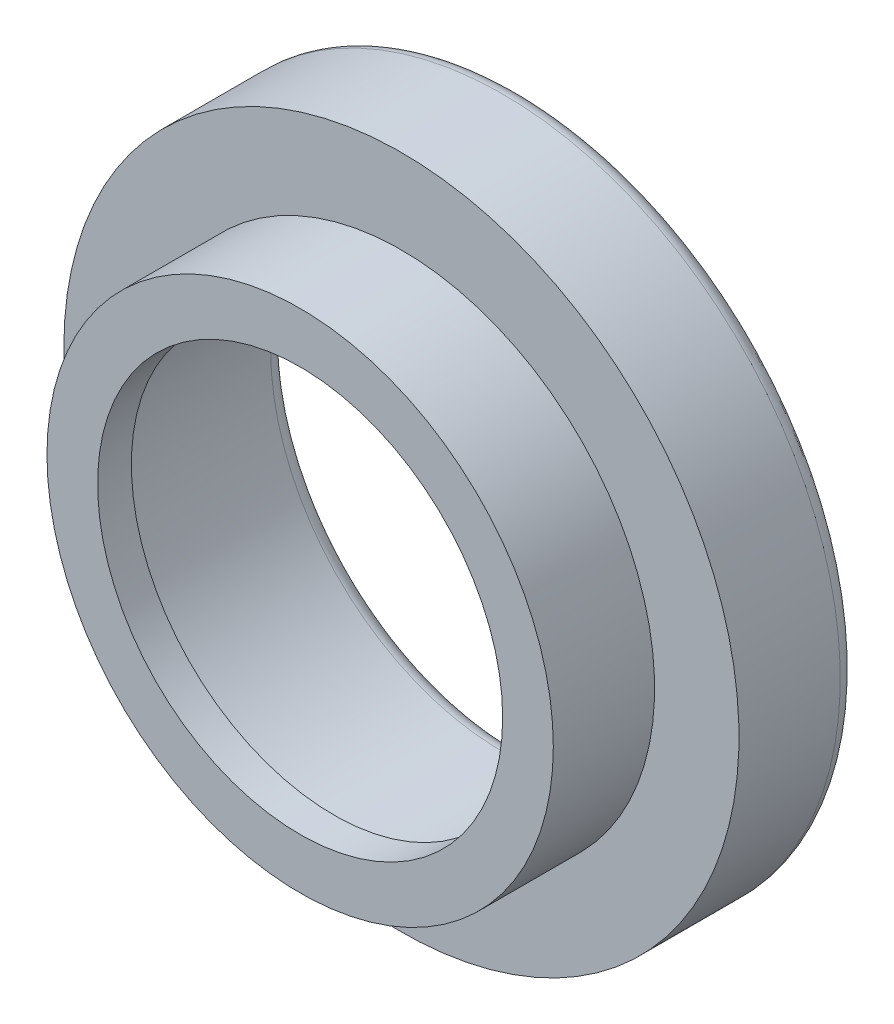
ISO-10303-21;
HEADER;
FILE_DESCRIPTION(('STEP AP214'),'2;1');
FILE_NAME('part.step','',(''),(''),'','','');
FILE_SCHEMA(('AUTOMOTIVE_DESIGN { 1 0 10303 214 1 1 1 1 }'));
ENDSEC;
DATA;
#1=APPLICATION_CONTEXT('core data for automotive mechanical design processes');
#2=APPLICATION_PROTOCOL_DEFINITION('international standard','automotive_design',2000,#1);
#3=PRODUCT_CONTEXT('',#1,'mechanical');
#4=PRODUCT('Part','Part','',(#3));
#5=PRODUCT_RELATED_PRODUCT_CATEGORY('part','',(#4));
#6=PRODUCT_DEFINITION_FORMATION('','',#4);
#7=PRODUCT_DEFINITION_CONTEXT('part definition',#1,'design');
#8=PRODUCT_DEFINITION('design','',#6,#7);
#9=PRODUCT_DEFINITION_SHAPE('','',#8);
#10=(LENGTH_UNIT() NAMED_UNIT(*) SI_UNIT(.MILLI.,.METRE.));
#11=(NAMED_UNIT(*) PLANE_ANGLE_UNIT() SI_UNIT($,.RADIAN.));
#12=(NAMED_UNIT(*) SI_UNIT($,.STERADIAN.) SOLID_ANGLE_UNIT());
#13=UNCERTAINTY_MEASURE_WITH_UNIT(LENGTH_MEASURE(1.E-05),#10,'distance_accuracy_value','');
#14=(GEOMETRIC_REPRESENTATION_CONTEXT(3) GLOBAL_UNCERTAINTY_ASSIGNED_CONTEXT((#13)) GLOBAL_UNIT_ASSIGNED_CONTEXT((#10,
#11,#12)) REPRESENTATION_CONTEXT('',''));
#15=CARTESIAN_POINT('',(0.,0.,0.));
#16=DIRECTION('',(0.,0.,1.));
#17=DIRECTION('',(1.,0.,0.));
#18=AXIS2_PLACEMENT_3D('',#15,#16,#17);
#19=CARTESIAN_POINT('',(0.,0.,4.));
#20=DIRECTION('',(0.,0.,-1.));
#21=DIRECTION('',(-1.,0.,0.));
#22=AXIS2_PLACEMENT_3D('',#19,#20,#21);
#23=CYLINDRICAL_SURFACE('',#22,15.);
#24=CARTESIAN_POINT('',(0.,0.,0.));
#25=DIRECTION('',(0.,0.,-1.));
#26=DIRECTION('',(-1.,0.,0.));
#27=AXIS2_PLACEMENT_3D('',#24,#25,#26);
#28=CIRCLE('',#27,15.);
#29=CARTESIAN_POINT('',(-15.,0.,0.));
#30=VERTEX_POINT('',#29);
#31=EDGE_CURVE('E69',#30,#30,#28,.T.);
#32=ORIENTED_EDGE('',*,*,#31,.F.);
#33=EDGE_LOOP('',(#32));
#34=FACE_BOUND('',#33,.T.);
#35=CARTESIAN_POINT('',(0.,0.,6.));
#36=DIRECTION('',(0.,0.,1.));
#37=DIRECTION('',(1.,0.,0.));
#38=AXIS2_PLACEMENT_3D('',#35,#36,#37);
#39=CIRCLE('',#38,15.);
#40=CARTESIAN_POINT('',(15.,0.,6.));
#41=VERTEX_POINT('',#40);
#42=EDGE_CURVE('E61',#41,#41,#39,.T.);
#43=ORIENTED_EDGE('',*,*,#42,.F.);
#44=EDGE_LOOP('',(#43));
#45=FACE_BOUND('',#44,.T.);
#46=ADVANCED_FACE('F39',(#34,#45),#23,.T.);
#47=CARTESIAN_POINT('',(0.,0.,4.));
#48=DIRECTION('',(0.,0.,-1.));
#49=DIRECTION('',(-1.,0.,0.));
#50=AXIS2_PLACEMENT_3D('',#47,#48,#49);
#51=CYLINDRICAL_SURFACE('',#50,13.75);
#52=CARTESIAN_POINT('',(0.,0.,-6.));
#53=DIRECTION('',(0.,0.,-1.));
#54=DIRECTION('',(-1.,0.,0.));
#55=AXIS2_PLACEMENT_3D('',#52,#53,#54);
#56=CIRCLE('',#55,13.75);
#57=CARTESIAN_POINT('',(-13.75,0.,-6.));
#58=VERTEX_POINT('',#57);
#59=EDGE_CURVE('E53',#58,#58,#56,.T.);
#60=ORIENTED_EDGE('',*,*,#59,.T.);
#61=EDGE_LOOP('',(#60));
#62=FACE_BOUND('',#61,.T.);
#63=CARTESIAN_POINT('',(0.,0.,4.));
#64=DIRECTION('',(0.,0.,1.));
#65=DIRECTION('',(1.,0.,0.));
#66=AXIS2_PLACEMENT_3D('',#63,#64,#65);
#67=CIRCLE('',#66,13.75);
#68=CARTESIAN_POINT('',(13.75,0.,4.));
#69=VERTEX_POINT('',#68);
#70=EDGE_CURVE('E56',#69,#69,#67,.T.);
#71=ORIENTED_EDGE('',*,*,#70,.T.);
#72=EDGE_LOOP('',(#71));
#73=FACE_BOUND('',#72,.T.);
#74=ADVANCED_FACE('F90',(#62,#73),#51,.F.);
#75=CARTESIAN_POINT('',(0.,0.,4.));
#76=DIRECTION('',(0.,0.,1.));
#77=DIRECTION('',(1.,0.,0.));
#78=AXIS2_PLACEMENT_3D('',#75,#76,#77);
#79=PLANE('',#78);
#80=CARTESIAN_POINT('',(0.,0.,4.));
#81=DIRECTION('',(0.,0.,1.));
#82=DIRECTION('',(1.,0.,0.));
#83=AXIS2_PLACEMENT_3D('',#80,#81,#82);
#84=CIRCLE('',#83,12.);
#85=CARTESIAN_POINT('',(12.,0.,4.));
#86=VERTEX_POINT('',#85);
#87=EDGE_CURVE('E68',#86,#86,#84,.T.);
#88=ORIENTED_EDGE('',*,*,#87,.T.);
#89=EDGE_LOOP('',(#88));
#90=FACE_BOUND('',#89,.T.);
#91=ORIENTED_EDGE('',*,*,#70,.F.);
#92=EDGE_LOOP('',(#91));
#93=FACE_BOUND('',#92,.T.);
#94=ADVANCED_FACE('F97',(#90,#93),#79,.F.);
#95=CARTESIAN_POINT('',(0.,0.,6.));
#96=DIRECTION('',(0.,0.,1.));
#97=DIRECTION('',(1.,0.,0.));
#98=AXIS2_PLACEMENT_3D('',#95,#96,#97);
#99=PLANE('',#98);
#100=ORIENTED_EDGE('',*,*,#42,.T.);
#101=EDGE_LOOP('',(#100));
#102=FACE_BOUND('',#101,.T.);
#103=CARTESIAN_POINT('',(0.,0.,6.));
#104=DIRECTION('',(0.,0.,1.));
#105=DIRECTION('',(1.,0.,0.));
#106=AXIS2_PLACEMENT_3D('',#103,#104,#105);
#107=CIRCLE('',#106,12.);
#108=CARTESIAN_POINT('',(12.,0.,6.));
#109=VERTEX_POINT('',#108);
#110=EDGE_CURVE('E62',#109,#109,#107,.T.);
#111=ORIENTED_EDGE('',*,*,#110,.F.);
#112=EDGE_LOOP('',(#111));
#113=FACE_BOUND('',#112,.T.);
#114=ADVANCED_FACE('F94',(#102,#113),#99,.T.);
#115=CARTESIAN_POINT('',(0.,0.,6.));
#116=DIRECTION('',(0.,0.,-1.));
#117=DIRECTION('',(-1.,0.,0.));
#118=AXIS2_PLACEMENT_3D('',#115,#116,#117);
#119=CYLINDRICAL_SURFACE('',#118,12.);
#120=ORIENTED_EDGE('',*,*,#110,.T.);
#121=EDGE_LOOP('',(#120));
#122=FACE_BOUND('',#121,.T.);
#123=ORIENTED_EDGE('',*,*,#87,.F.);
#124=EDGE_LOOP('',(#123));
#125=FACE_BOUND('',#124,.T.);
#126=ADVANCED_FACE('F83',(#122,#125),#119,.F.);
#127=CARTESIAN_POINT('',(0.,0.,0.));
#128=DIRECTION('',(0.,0.,-1.));
#129=DIRECTION('',(-1.,0.,0.));
#130=AXIS2_PLACEMENT_3D('',#127,#128,#129);
#131=PLANE('',#130);
#132=CARTESIAN_POINT('',(0.,0.,0.));
#133=DIRECTION('',(0.,0.,-1.));
#134=DIRECTION('',(-1.,0.,0.));
#135=AXIS2_PLACEMENT_3D('',#132,#133,#134);
#136=CIRCLE('',#135,20.);
#137=CARTESIAN_POINT('',(-20.,0.,0.));
#138=VERTEX_POINT('',#137);
#139=EDGE_CURVE('E73',#138,#138,#136,.T.);
#140=ORIENTED_EDGE('',*,*,#139,.F.);
#141=EDGE_LOOP('',(#140));
#142=FACE_BOUND('',#141,.T.);
#143=ORIENTED_EDGE('',*,*,#31,.T.);
#144=EDGE_LOOP('',(#143));
#145=FACE_BOUND('',#144,.T.);
#146=ADVANCED_FACE('F78',(#142,#145),#131,.F.);
#147=CARTESIAN_POINT('',(0.,0.,-7.));
#148=DIRECTION('',(0.,0.,-1.));
#149=DIRECTION('',(-1.,0.,0.));
#150=AXIS2_PLACEMENT_3D('',#147,#148,#149);
#151=PLANE('',#150);
#152=CARTESIAN_POINT('',(0.,0.,-7.));
#153=DIRECTION('',(0.,0.,-1.));
#154=DIRECTION('',(-1.,0.,0.));
#155=AXIS2_PLACEMENT_3D('',#152,#153,#154);
#156=CIRCLE('',#155,19.);
#157=CARTESIAN_POINT('',(-19.,0.,-7.));
#158=VERTEX_POINT('',#157);
#159=EDGE_CURVE('E46',#158,#158,#156,.T.);
#160=ORIENTED_EDGE('',*,*,#159,.T.);
#161=EDGE_LOOP('',(#160));
#162=FACE_BOUND('',#161,.T.);
#163=CARTESIAN_POINT('',(0.,0.,-7.));
#164=DIRECTION('',(0.,0.,-1.));
#165=DIRECTION('',(-1.,0.,0.));
#166=AXIS2_PLACEMENT_3D('',#163,#164,#165);
#167=CIRCLE('',#166,14.75);
#168=CARTESIAN_POINT('',(-14.75,0.,-7.));
#169=VERTEX_POINT('',#168);
#170=EDGE_CURVE('E49',#169,#169,#167,.F.);
#171=ORIENTED_EDGE('',*,*,#170,.T.);
#172=EDGE_LOOP('',(#171));
#173=FACE_BOUND('',#172,.T.);
#174=ADVANCED_FACE('F85',(#162,#173),#151,.T.);
#175=CARTESIAN_POINT('',(0.,0.,-7.));
#176=DIRECTION('',(0.,0.,1.));
#177=DIRECTION('',(1.,0.,0.));
#178=AXIS2_PLACEMENT_3D('',#175,#176,#177);
#179=CYLINDRICAL_SURFACE('',#178,20.);
#180=CARTESIAN_POINT('',(0.,0.,-6.));
#181=DIRECTION('',(0.,0.,-1.));
#182=DIRECTION('',(-1.,0.,0.));
#183=AXIS2_PLACEMENT_3D('',#180,#181,#182);
#184=CIRCLE('',#183,20.);
#185=CARTESIAN_POINT('',(-20.,0.,-6.));
#186=VERTEX_POINT('',#185);
#187=EDGE_CURVE('E10',#186,#186,#184,.F.);
#188=ORIENTED_EDGE('',*,*,#187,.T.);
#189=EDGE_LOOP('',(#188));
#190=FACE_BOUND('',#189,.T.);
#191=ORIENTED_EDGE('',*,*,#139,.T.);
#192=EDGE_LOOP('',(#191));
#193=FACE_BOUND('',#192,.T.);
#194=ADVANCED_FACE('F76',(#190,#193),#179,.T.);
#195=CARTESIAN_POINT('',(0.,0.,-6.));
#196=DIRECTION('',(0.,0.,-1.));
#197=DIRECTION('',(-1.,0.,0.));
#198=AXIS2_PLACEMENT_3D('',#195,#196,#197);
#199=TOROIDAL_SURFACE('',#198,14.75,1.);
#200=ORIENTED_EDGE('',*,*,#170,.F.);
#201=EDGE_LOOP('',(#200));
#202=FACE_BOUND('',#201,.T.);
#203=ORIENTED_EDGE('',*,*,#59,.F.);
#204=EDGE_LOOP('',(#203));
#205=FACE_BOUND('',#204,.T.);
#206=ADVANCED_FACE('F120',(#202,#205),#199,.T.);
#207=CARTESIAN_POINT('',(0.,0.,-6.));
#208=DIRECTION('',(0.,0.,-1.));
#209=DIRECTION('',(-1.,0.,0.));
#210=AXIS2_PLACEMENT_3D('',#207,#208,#209);
#211=TOROIDAL_SURFACE('',#210,19.,1.);
#212=ORIENTED_EDGE('',*,*,#187,.F.);
#213=EDGE_LOOP('',(#212));
#214=FACE_BOUND('',#213,.T.);
#215=ORIENTED_EDGE('',*,*,#159,.F.);
#216=EDGE_LOOP('',(#215));
#217=FACE_BOUND('',#216,.T.);
#218=ADVANCED_FACE('F41',(#214,#217),#211,.T.);
#219=CLOSED_SHELL('',(#46,#74,#94,#114,#126,#146,#174,#194,#206,#218));
#220=MANIFOLD_SOLID_BREP('B2',#219);
#221=ADVANCED_BREP_SHAPE_REPRESENTATION('',(#18,#220),#14);
#222=SHAPE_DEFINITION_REPRESENTATION(#9,#221);
ENDSEC;
END-ISO-10303-21;
